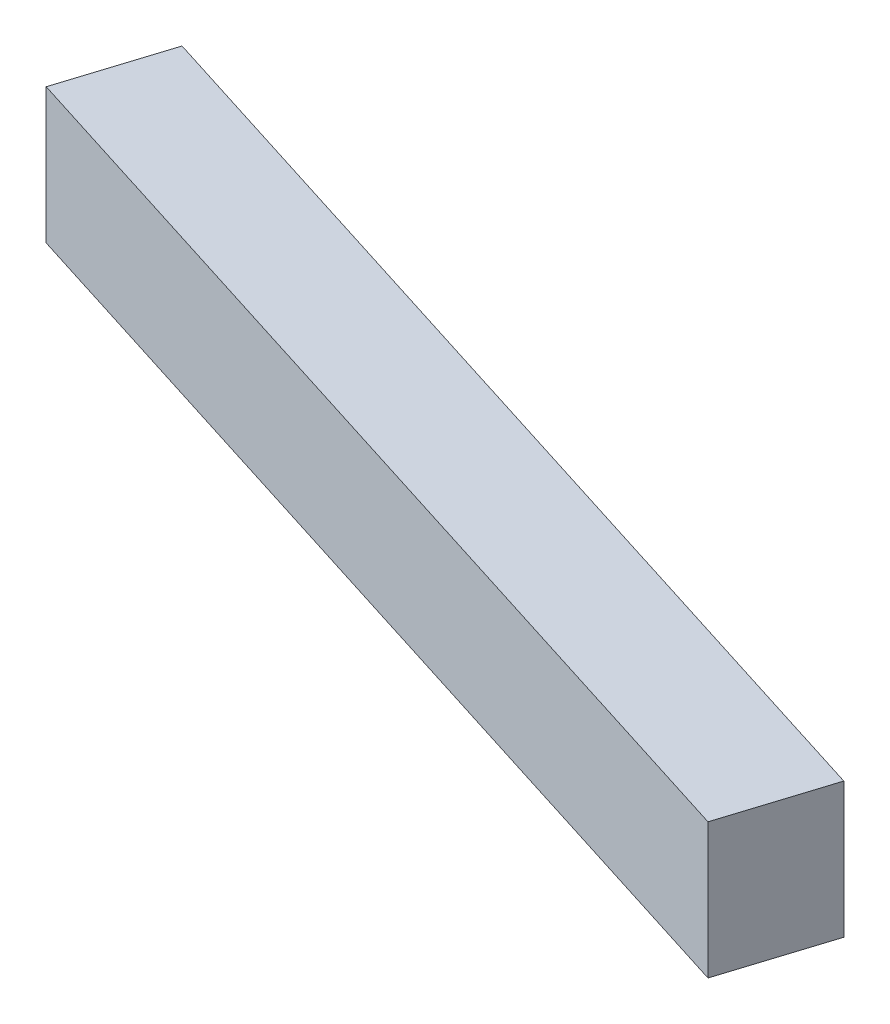
ISO-10303-21;
HEADER;
FILE_DESCRIPTION(('STEP AP214'),'2;1');
FILE_NAME('part.step','',(''),(''),'','','');
FILE_SCHEMA(('AUTOMOTIVE_DESIGN { 1 0 10303 214 1 1 1 1 }'));
ENDSEC;
DATA;
#1=APPLICATION_CONTEXT('core data for automotive mechanical design processes');
#2=APPLICATION_PROTOCOL_DEFINITION('international standard','automotive_design',2000,#1);
#3=PRODUCT_CONTEXT('',#1,'mechanical');
#4=PRODUCT('Part','Part','',(#3));
#5=PRODUCT_RELATED_PRODUCT_CATEGORY('part','',(#4));
#6=PRODUCT_DEFINITION_FORMATION('','',#4);
#7=PRODUCT_DEFINITION_CONTEXT('part definition',#1,'design');
#8=PRODUCT_DEFINITION('design','',#6,#7);
#9=PRODUCT_DEFINITION_SHAPE('','',#8);
#10=(LENGTH_UNIT() NAMED_UNIT(*) SI_UNIT(.MILLI.,.METRE.));
#11=(NAMED_UNIT(*) PLANE_ANGLE_UNIT() SI_UNIT($,.RADIAN.));
#12=(NAMED_UNIT(*) SI_UNIT($,.STERADIAN.) SOLID_ANGLE_UNIT());
#13=UNCERTAINTY_MEASURE_WITH_UNIT(LENGTH_MEASURE(1.E-05),#10,'distance_accuracy_value','');
#14=(GEOMETRIC_REPRESENTATION_CONTEXT(3) GLOBAL_UNCERTAINTY_ASSIGNED_CONTEXT((#13)) GLOBAL_UNIT_ASSIGNED_CONTEXT((#10,
#11,#12)) REPRESENTATION_CONTEXT('',''));
#15=CARTESIAN_POINT('',(0.,0.,0.));
#16=DIRECTION('',(0.,0.,1.));
#17=DIRECTION('',(1.,0.,0.));
#18=AXIS2_PLACEMENT_3D('',#15,#16,#17);
#19=CARTESIAN_POINT('',(-17.1905366945437,7.874,-5.3261566302678));
#20=DIRECTION('',(0.301293883319954,0.,-0.953531329256665));
#21=DIRECTION('',(-0.953531329256665,0.,-0.301293883319954));
#22=AXIS2_PLACEMENT_3D('',#19,#20,#21);
#23=PLANE('',#22);
#24=DIRECTION('',(0.,1.,0.));
#25=VECTOR('',#24,1.);
#26=CARTESIAN_POINT('',(-17.1905366945437,7.874,-5.3261566302678));
#27=LINE('',#26,#25);
#28=CARTESIAN_POINT('',(-17.1905366945437,7.62,-5.3261566302678));
#29=VERTEX_POINT('',#28);
#30=CARTESIAN_POINT('',(-17.1905366945437,7.874,-5.3261566302678));
#31=VERTEX_POINT('',#30);
#32=EDGE_CURVE('E20',#29,#31,#27,.T.);
#33=ORIENTED_EDGE('',*,*,#32,.T.);
#34=DIRECTION('',(-0.953531329256663,0.,-0.30129388331996));
#35=VECTOR('',#34,1.);
#36=CARTESIAN_POINT('',(-17.1905366945437,7.874,-5.3261566302678));
#37=LINE('',#36,#35);
#38=CARTESIAN_POINT('',(-19.0070138767776,7.874,-5.90012147799231));
#39=VERTEX_POINT('',#38);
#40=EDGE_CURVE('E55',#31,#39,#37,.T.);
#41=ORIENTED_EDGE('',*,*,#40,.T.);
#42=DIRECTION('',(0.,1.,0.));
#43=VECTOR('',#42,1.);
#44=CARTESIAN_POINT('',(-19.0070138767776,7.874,-5.90012147799231));
#45=LINE('',#44,#43);
#46=CARTESIAN_POINT('',(-19.0070138767776,7.62,-5.9001214779923));
#47=VERTEX_POINT('',#46);
#48=EDGE_CURVE('E76',#39,#47,#45,.F.);
#49=ORIENTED_EDGE('',*,*,#48,.T.);
#50=DIRECTION('',(-0.953531329256663,0.,-0.30129388331996));
#51=VECTOR('',#50,1.);
#52=CARTESIAN_POINT('',(-17.1905366945437,7.62,-5.3261566302678));
#53=LINE('',#52,#51);
#54=EDGE_CURVE('E58',#29,#47,#53,.T.);
#55=ORIENTED_EDGE('',*,*,#54,.F.);
#56=EDGE_LOOP('',(#33,#41,#49,#55));
#57=FACE_BOUND('',#56,.T.);
#58=ADVANCED_FACE('F17',(#57),#23,.F.);
#59=CARTESIAN_POINT('',(-17.1905366945437,7.874,-5.3261566302678));
#60=DIRECTION('',(-0.953531329256677,0.,-0.301293883319916));
#61=DIRECTION('',(-0.301293883319916,0.,0.953531329256677));
#62=AXIS2_PLACEMENT_3D('',#59,#60,#61);
#63=PLANE('',#62);
#64=DIRECTION('',(0.,1.,0.));
#65=VECTOR('',#64,1.);
#66=CARTESIAN_POINT('',(-17.1293137774531,7.874,-5.51991419637276));
#67=LINE('',#66,#65);
#68=CARTESIAN_POINT('',(-17.1293137774531,7.62,-5.51991419637276));
#69=VERTEX_POINT('',#68);
#70=CARTESIAN_POINT('',(-17.1293137774531,7.874,-5.51991419637276));
#71=VERTEX_POINT('',#70);
#72=EDGE_CURVE('E73',#69,#71,#67,.T.);
#73=ORIENTED_EDGE('',*,*,#72,.T.);
#74=DIRECTION('',(-0.301293883319885,0.,0.953531329256686));
#75=VECTOR('',#74,1.);
#76=CARTESIAN_POINT('',(-17.1293137774531,7.874,-5.51991419637276));
#77=LINE('',#76,#75);
#78=EDGE_CURVE('E63',#71,#31,#77,.T.);
#79=ORIENTED_EDGE('',*,*,#78,.T.);
#80=ORIENTED_EDGE('',*,*,#32,.F.);
#81=DIRECTION('',(-0.301293883319885,0.,0.953531329256686));
#82=VECTOR('',#81,1.);
#83=CARTESIAN_POINT('',(-17.1293137774531,7.62,-5.51991419637276));
#84=LINE('',#83,#82);
#85=EDGE_CURVE('E80',#69,#29,#84,.T.);
#86=ORIENTED_EDGE('',*,*,#85,.F.);
#87=EDGE_LOOP('',(#73,#79,#80,#86));
#88=FACE_BOUND('',#87,.T.);
#89=ADVANCED_FACE('F72',(#88),#63,.F.);
#90=CARTESIAN_POINT('',(-17.1905366945437,7.874,-5.3261566302678));
#91=DIRECTION('',(0.,-1.,0.));
#92=DIRECTION('',(0.,0.,-1.));
#93=AXIS2_PLACEMENT_3D('',#90,#91,#92);
#94=PLANE('',#93);
#95=ORIENTED_EDGE('',*,*,#78,.F.);
#96=DIRECTION('',(0.953531329256665,0.,0.301293883319953));
#97=VECTOR('',#96,1.);
#98=CARTESIAN_POINT('',(-17.1293137774531,7.874,-5.51991419637276));
#99=LINE('',#98,#97);
#100=CARTESIAN_POINT('',(-18.945790959982,7.874,-6.09387904419046));
#101=VERTEX_POINT('',#100);
#102=EDGE_CURVE('E83',#71,#101,#99,.F.);
#103=ORIENTED_EDGE('',*,*,#102,.T.);
#104=DIRECTION('',(0.301293881868386,0.,-0.953531329715327));
#105=VECTOR('',#104,1.);
#106=CARTESIAN_POINT('',(-19.0070138767776,7.874,-5.90012147799231));
#107=LINE('',#106,#105);
#108=EDGE_CURVE('E69',#101,#39,#107,.F.);
#109=ORIENTED_EDGE('',*,*,#108,.T.);
#110=ORIENTED_EDGE('',*,*,#40,.F.);
#111=EDGE_LOOP('',(#95,#103,#109,#110));
#112=FACE_BOUND('',#111,.T.);
#113=ADVANCED_FACE('F66',(#112),#94,.F.);
#114=CARTESIAN_POINT('',(-19.0070138767776,7.874,-5.90012147799231));
#115=DIRECTION('',(0.953531329715327,0.,0.301293881868386));
#116=DIRECTION('',(0.301293881868386,0.,-0.953531329715327));
#117=AXIS2_PLACEMENT_3D('',#114,#115,#116);
#118=PLANE('',#117);
#119=ORIENTED_EDGE('',*,*,#48,.F.);
#120=ORIENTED_EDGE('',*,*,#108,.F.);
#121=DIRECTION('',(0.,1.,0.));
#122=VECTOR('',#121,1.);
#123=CARTESIAN_POINT('',(-18.945790959982,7.874,-6.09387904419047));
#124=LINE('',#123,#122);
#125=CARTESIAN_POINT('',(-18.945790959982,7.62,-6.09387904419045));
#126=VERTEX_POINT('',#125);
#127=EDGE_CURVE('E26',#101,#126,#124,.F.);
#128=ORIENTED_EDGE('',*,*,#127,.T.);
#129=DIRECTION('',(0.301293881868147,0.,-0.953531329715402));
#130=VECTOR('',#129,1.);
#131=CARTESIAN_POINT('',(-19.0070138767776,7.62,-5.90012147799231));
#132=LINE('',#131,#130);
#133=EDGE_CURVE('E34',#47,#126,#132,.T.);
#134=ORIENTED_EDGE('',*,*,#133,.F.);
#135=EDGE_LOOP('',(#119,#120,#128,#134));
#136=FACE_BOUND('',#135,.T.);
#137=ADVANCED_FACE('F88',(#136),#118,.F.);
#138=CARTESIAN_POINT('',(-17.1905366945437,7.62,-5.3261566302678));
#139=DIRECTION('',(0.,-1.,0.));
#140=DIRECTION('',(0.,0.,-1.));
#141=AXIS2_PLACEMENT_3D('',#138,#139,#140);
#142=PLANE('',#141);
#143=DIRECTION('',(0.953531329256665,0.,0.301293883319953));
#144=VECTOR('',#143,1.);
#145=CARTESIAN_POINT('',(-17.1293137774531,7.62,-5.51991419637276));
#146=LINE('',#145,#144);
#147=EDGE_CURVE('E11',#126,#69,#146,.T.);
#148=ORIENTED_EDGE('',*,*,#147,.T.);
#149=ORIENTED_EDGE('',*,*,#85,.T.);
#150=ORIENTED_EDGE('',*,*,#54,.T.);
#151=ORIENTED_EDGE('',*,*,#133,.T.);
#152=EDGE_LOOP('',(#148,#149,#150,#151));
#153=FACE_BOUND('',#152,.T.);
#154=ADVANCED_FACE('F91',(#153),#142,.T.);
#155=CARTESIAN_POINT('',(-17.1293137774531,7.874,-5.51991419637276));
#156=DIRECTION('',(-0.301293883319953,0.,0.953531329256665));
#157=DIRECTION('',(0.953531329256665,0.,0.301293883319953));
#158=AXIS2_PLACEMENT_3D('',#155,#156,#157);
#159=PLANE('',#158);
#160=ORIENTED_EDGE('',*,*,#127,.F.);
#161=ORIENTED_EDGE('',*,*,#102,.F.);
#162=ORIENTED_EDGE('',*,*,#72,.F.);
#163=ORIENTED_EDGE('',*,*,#147,.F.);
#164=EDGE_LOOP('',(#160,#161,#162,#163));
#165=FACE_BOUND('',#164,.T.);
#166=ADVANCED_FACE('F90',(#165),#159,.F.);
#167=CLOSED_SHELL('',(#58,#89,#113,#137,#154,#166));
#168=MANIFOLD_SOLID_BREP('B1',#167);
#169=ADVANCED_BREP_SHAPE_REPRESENTATION('',(#18,#168),#14);
#170=SHAPE_DEFINITION_REPRESENTATION(#9,#169);
ENDSEC;
END-ISO-10303-21;
